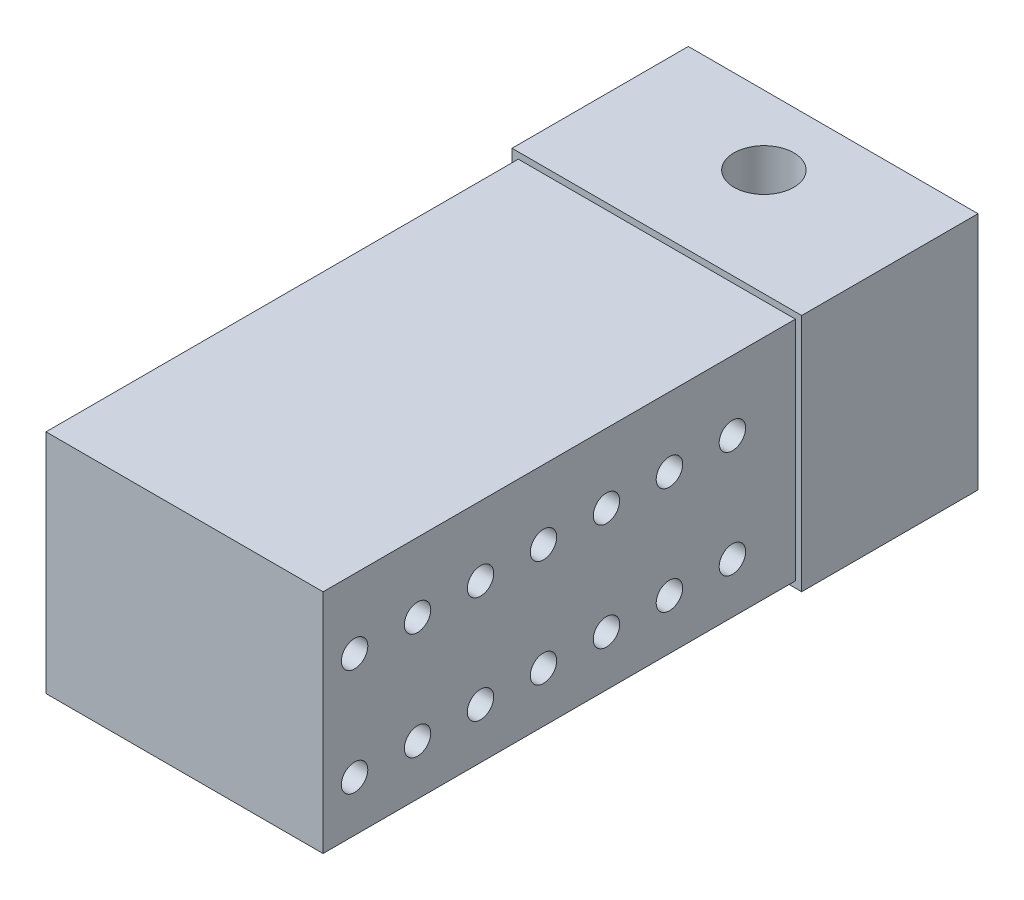
ISO-10303-21;
HEADER;
FILE_DESCRIPTION(('STEP AP214'),'2;1');
FILE_NAME('part.step','',(''),(''),'','','');
FILE_SCHEMA(('AUTOMOTIVE_DESIGN { 1 0 10303 214 1 1 1 1 }'));
ENDSEC;
DATA;
#1=APPLICATION_CONTEXT('core data for automotive mechanical design processes');
#2=APPLICATION_PROTOCOL_DEFINITION('international standard','automotive_design',2000,#1);
#3=PRODUCT_CONTEXT('',#1,'mechanical');
#4=PRODUCT('Part','Part','',(#3));
#5=PRODUCT_RELATED_PRODUCT_CATEGORY('part','',(#4));
#6=PRODUCT_DEFINITION_FORMATION('','',#4);
#7=PRODUCT_DEFINITION_CONTEXT('part definition',#1,'design');
#8=PRODUCT_DEFINITION('design','',#6,#7);
#9=PRODUCT_DEFINITION_SHAPE('','',#8);
#10=(LENGTH_UNIT() NAMED_UNIT(*) SI_UNIT(.MILLI.,.METRE.));
#11=(NAMED_UNIT(*) PLANE_ANGLE_UNIT() SI_UNIT($,.RADIAN.));
#12=(NAMED_UNIT(*) SI_UNIT($,.STERADIAN.) SOLID_ANGLE_UNIT());
#13=UNCERTAINTY_MEASURE_WITH_UNIT(LENGTH_MEASURE(1.E-05),#10,'distance_accuracy_value','');
#14=(GEOMETRIC_REPRESENTATION_CONTEXT(3) GLOBAL_UNCERTAINTY_ASSIGNED_CONTEXT((#13)) GLOBAL_UNIT_ASSIGNED_CONTEXT((#10,
#11,#12)) REPRESENTATION_CONTEXT('',''));
#15=CARTESIAN_POINT('',(0.,0.,0.));
#16=DIRECTION('',(0.,0.,1.));
#17=DIRECTION('',(1.,0.,0.));
#18=AXIS2_PLACEMENT_3D('',#15,#16,#17);
#19=CARTESIAN_POINT('',(0.,0.,7.112));
#20=DIRECTION('',(0.,0.,1.));
#21=DIRECTION('',(1.,0.,0.));
#22=AXIS2_PLACEMENT_3D('',#19,#20,#21);
#23=PLANE('',#22);
#24=DIRECTION('',(0.,1.,0.));
#25=VECTOR('',#24,1.);
#26=CARTESIAN_POINT('',(5.842,4.826,7.112));
#27=LINE('',#26,#25);
#28=CARTESIAN_POINT('',(5.842,-4.826,7.112));
#29=VERTEX_POINT('',#28);
#30=CARTESIAN_POINT('',(5.842,4.826,7.112));
#31=VERTEX_POINT('',#30);
#32=EDGE_CURVE('E250',#29,#31,#27,.T.);
#33=ORIENTED_EDGE('',*,*,#32,.T.);
#34=DIRECTION('',(-1.,0.,0.));
#35=VECTOR('',#34,1.);
#36=CARTESIAN_POINT('',(-5.842,4.826,7.112));
#37=LINE('',#36,#35);
#38=CARTESIAN_POINT('',(-5.842,4.826,7.112));
#39=VERTEX_POINT('',#38);
#40=EDGE_CURVE('E253',#31,#39,#37,.T.);
#41=ORIENTED_EDGE('',*,*,#40,.T.);
#42=DIRECTION('',(0.,-1.,0.));
#43=VECTOR('',#42,1.);
#44=CARTESIAN_POINT('',(-5.842,4.826,7.112));
#45=LINE('',#44,#43);
#46=CARTESIAN_POINT('',(-5.842,-4.826,7.112));
#47=VERTEX_POINT('',#46);
#48=EDGE_CURVE('E256',#39,#47,#45,.T.);
#49=ORIENTED_EDGE('',*,*,#48,.T.);
#50=DIRECTION('',(1.,0.,0.));
#51=VECTOR('',#50,1.);
#52=CARTESIAN_POINT('',(-5.842,-4.826,7.112));
#53=LINE('',#52,#51);
#54=EDGE_CURVE('E258',#47,#29,#53,.T.);
#55=ORIENTED_EDGE('',*,*,#54,.T.);
#56=EDGE_LOOP('',(#33,#41,#49,#55));
#57=FACE_BOUND('',#56,.T.);
#58=DIRECTION('',(1.,0.,0.));
#59=VECTOR('',#58,1.);
#60=CARTESIAN_POINT('',(-5.588,-4.572,7.112));
#61=LINE('',#60,#59);
#62=CARTESIAN_POINT('',(-5.588,-4.572,7.112));
#63=VERTEX_POINT('',#62);
#64=CARTESIAN_POINT('',(5.588,-4.572,7.112));
#65=VERTEX_POINT('',#64);
#66=EDGE_CURVE('E678',#63,#65,#61,.T.);
#67=ORIENTED_EDGE('',*,*,#66,.F.);
#68=DIRECTION('',(0.,-1.,0.));
#69=VECTOR('',#68,1.);
#70=CARTESIAN_POINT('',(-5.588,4.572,7.112));
#71=LINE('',#70,#69);
#72=CARTESIAN_POINT('',(-5.588,4.572,7.112));
#73=VERTEX_POINT('',#72);
#74=EDGE_CURVE('E172',#73,#63,#71,.T.);
#75=ORIENTED_EDGE('',*,*,#74,.F.);
#76=DIRECTION('',(-1.,0.,0.));
#77=VECTOR('',#76,1.);
#78=CARTESIAN_POINT('',(5.588,4.572,7.112));
#79=LINE('',#78,#77);
#80=CARTESIAN_POINT('',(5.588,4.572,7.112));
#81=VERTEX_POINT('',#80);
#82=EDGE_CURVE('E168',#81,#73,#79,.T.);
#83=ORIENTED_EDGE('',*,*,#82,.F.);
#84=DIRECTION('',(0.,1.,0.));
#85=VECTOR('',#84,1.);
#86=CARTESIAN_POINT('',(5.588,-4.572,7.112));
#87=LINE('',#86,#85);
#88=EDGE_CURVE('E680',#65,#81,#87,.T.);
#89=ORIENTED_EDGE('',*,*,#88,.F.);
#90=EDGE_LOOP('',(#67,#75,#83,#89));
#91=FACE_BOUND('',#90,.T.);
#92=ADVANCED_FACE('F33',(#57,#91),#23,.T.);
#93=CARTESIAN_POINT('',(0.,0.,0.));
#94=DIRECTION('',(0.,0.,1.));
#95=DIRECTION('',(1.,0.,0.));
#96=AXIS2_PLACEMENT_3D('',#93,#94,#95);
#97=PLANE('',#96);
#98=DIRECTION('',(0.,1.,0.));
#99=VECTOR('',#98,1.);
#100=CARTESIAN_POINT('',(5.842,4.826,0.));
#101=LINE('',#100,#99);
#102=CARTESIAN_POINT('',(5.842,-4.826,0.));
#103=VERTEX_POINT('',#102);
#104=CARTESIAN_POINT('',(5.842,4.826,0.));
#105=VERTEX_POINT('',#104);
#106=EDGE_CURVE('E249',#103,#105,#101,.T.);
#107=ORIENTED_EDGE('',*,*,#106,.F.);
#108=DIRECTION('',(1.,0.,0.));
#109=VECTOR('',#108,1.);
#110=CARTESIAN_POINT('',(-5.842,-4.826,0.));
#111=LINE('',#110,#109);
#112=CARTESIAN_POINT('',(-5.842,-4.826,0.));
#113=VERTEX_POINT('',#112);
#114=EDGE_CURVE('E254',#113,#103,#111,.T.);
#115=ORIENTED_EDGE('',*,*,#114,.F.);
#116=DIRECTION('',(0.,-1.,0.));
#117=VECTOR('',#116,1.);
#118=CARTESIAN_POINT('',(-5.842,4.826,0.));
#119=LINE('',#118,#117);
#120=CARTESIAN_POINT('',(-5.842,4.826,0.));
#121=VERTEX_POINT('',#120);
#122=EDGE_CURVE('E265',#121,#113,#119,.T.);
#123=ORIENTED_EDGE('',*,*,#122,.F.);
#124=DIRECTION('',(-1.,0.,0.));
#125=VECTOR('',#124,1.);
#126=CARTESIAN_POINT('',(-5.842,4.826,0.));
#127=LINE('',#126,#125);
#128=EDGE_CURVE('E263',#105,#121,#127,.T.);
#129=ORIENTED_EDGE('',*,*,#128,.F.);
#130=EDGE_LOOP('',(#107,#115,#123,#129));
#131=FACE_BOUND('',#130,.T.);
#132=DIRECTION('',(0.,-1.,0.));
#133=VECTOR('',#132,1.);
#134=CARTESIAN_POINT('',(-4.064,-0.381,0.));
#135=LINE('',#134,#133);
#136=CARTESIAN_POINT('',(-4.064,-0.381,0.));
#137=VERTEX_POINT('',#136);
#138=CARTESIAN_POINT('',(-4.064,-3.048,0.));
#139=VERTEX_POINT('',#138);
#140=EDGE_CURVE('E57',#137,#139,#135,.T.);
#141=ORIENTED_EDGE('',*,*,#140,.T.);
#142=DIRECTION('',(1.,0.,0.));
#143=VECTOR('',#142,1.);
#144=CARTESIAN_POINT('',(-4.064,-3.048,0.));
#145=LINE('',#144,#143);
#146=CARTESIAN_POINT('',(4.064,-3.048,0.));
#147=VERTEX_POINT('',#146);
#148=EDGE_CURVE('E214',#139,#147,#145,.T.);
#149=ORIENTED_EDGE('',*,*,#148,.T.);
#150=DIRECTION('',(0.,1.,0.));
#151=VECTOR('',#150,1.);
#152=CARTESIAN_POINT('',(4.064,-3.048,0.));
#153=LINE('',#152,#151);
#154=CARTESIAN_POINT('',(4.064,-0.381,0.));
#155=VERTEX_POINT('',#154);
#156=EDGE_CURVE('E217',#147,#155,#153,.T.);
#157=ORIENTED_EDGE('',*,*,#156,.T.);
#158=DIRECTION('',(-1.,0.,0.));
#159=VECTOR('',#158,1.);
#160=CARTESIAN_POINT('',(4.064,-0.381,0.));
#161=LINE('',#160,#159);
#162=CARTESIAN_POINT('',(3.048,-0.380999999999999,0.));
#163=VERTEX_POINT('',#162);
#164=EDGE_CURVE('E220',#155,#163,#161,.T.);
#165=ORIENTED_EDGE('',*,*,#164,.T.);
#166=DIRECTION('',(0.,1.,0.));
#167=VECTOR('',#166,1.);
#168=CARTESIAN_POINT('',(3.048,-0.380999999999999,0.));
#169=LINE('',#168,#167);
#170=CARTESIAN_POINT('',(3.048,3.048,0.));
#171=VERTEX_POINT('',#170);
#172=EDGE_CURVE('E223',#163,#171,#169,.T.);
#173=ORIENTED_EDGE('',*,*,#172,.T.);
#174=DIRECTION('',(-1.,0.,0.));
#175=VECTOR('',#174,1.);
#176=CARTESIAN_POINT('',(3.048,3.048,0.));
#177=LINE('',#176,#175);
#178=CARTESIAN_POINT('',(-3.048,3.048,0.));
#179=VERTEX_POINT('',#178);
#180=EDGE_CURVE('E226',#171,#179,#177,.T.);
#181=ORIENTED_EDGE('',*,*,#180,.T.);
#182=DIRECTION('',(0.,-1.,0.));
#183=VECTOR('',#182,1.);
#184=CARTESIAN_POINT('',(-3.048,3.048,0.));
#185=LINE('',#184,#183);
#186=CARTESIAN_POINT('',(-3.048,-0.380999999999999,0.));
#187=VERTEX_POINT('',#186);
#188=EDGE_CURVE('E229',#179,#187,#185,.T.);
#189=ORIENTED_EDGE('',*,*,#188,.T.);
#190=DIRECTION('',(-1.,0.,0.));
#191=VECTOR('',#190,1.);
#192=CARTESIAN_POINT('',(-3.048,-0.380999999999999,0.));
#193=LINE('',#192,#191);
#194=EDGE_CURVE('E191',#187,#137,#193,.T.);
#195=ORIENTED_EDGE('',*,*,#194,.T.);
#196=EDGE_LOOP('',(#141,#149,#157,#165,#173,#181,#189,#195));
#197=FACE_BOUND('',#196,.T.);
#198=ADVANCED_FACE('F284',(#131,#197),#97,.F.);
#199=CARTESIAN_POINT('',(5.842,4.826,7.112));
#200=DIRECTION('',(-1.,0.,0.));
#201=DIRECTION('',(0.,0.,1.));
#202=AXIS2_PLACEMENT_3D('',#199,#200,#201);
#203=PLANE('',#202);
#204=ORIENTED_EDGE('',*,*,#106,.T.);
#205=DIRECTION('',(0.,0.,-1.));
#206=VECTOR('',#205,1.);
#207=CARTESIAN_POINT('',(5.842,4.826,7.112));
#208=LINE('',#207,#206);
#209=EDGE_CURVE('E11',#31,#105,#208,.T.);
#210=ORIENTED_EDGE('',*,*,#209,.F.);
#211=ORIENTED_EDGE('',*,*,#32,.F.);
#212=DIRECTION('',(0.,0.,-1.));
#213=VECTOR('',#212,1.);
#214=CARTESIAN_POINT('',(5.842,-4.826,7.112));
#215=LINE('',#214,#213);
#216=EDGE_CURVE('E260',#29,#103,#215,.T.);
#217=ORIENTED_EDGE('',*,*,#216,.T.);
#218=EDGE_LOOP('',(#204,#210,#211,#217));
#219=FACE_BOUND('',#218,.T.);
#220=ADVANCED_FACE('F35',(#219),#203,.F.);
#221=CARTESIAN_POINT('',(-5.842,4.826,7.112));
#222=DIRECTION('',(0.,-1.,0.));
#223=DIRECTION('',(0.,0.,-1.));
#224=AXIS2_PLACEMENT_3D('',#221,#222,#223);
#225=PLANE('',#224);
#226=CARTESIAN_POINT('',(0.,4.826,2.794));
#227=DIRECTION('',(0.,-1.,0.));
#228=DIRECTION('',(0.,0.,-1.));
#229=AXIS2_PLACEMENT_3D('',#226,#227,#228);
#230=CIRCLE('',#229,1.2065);
#231=CARTESIAN_POINT('',(0.,4.826,1.5875));
#232=VERTEX_POINT('',#231);
#233=EDGE_CURVE('E184',#232,#232,#230,.T.);
#234=ORIENTED_EDGE('',*,*,#233,.T.);
#235=EDGE_LOOP('',(#234));
#236=FACE_BOUND('',#235,.T.);
#237=ORIENTED_EDGE('',*,*,#128,.T.);
#238=DIRECTION('',(0.,0.,-1.));
#239=VECTOR('',#238,1.);
#240=CARTESIAN_POINT('',(-5.842,4.826,7.112));
#241=LINE('',#240,#239);
#242=EDGE_CURVE('E42',#39,#121,#241,.T.);
#243=ORIENTED_EDGE('',*,*,#242,.F.);
#244=ORIENTED_EDGE('',*,*,#40,.F.);
#245=ORIENTED_EDGE('',*,*,#209,.T.);
#246=EDGE_LOOP('',(#237,#243,#244,#245));
#247=FACE_BOUND('',#246,.T.);
#248=ADVANCED_FACE('F295',(#236,#247),#225,.F.);
#249=CARTESIAN_POINT('',(-5.842,4.826,7.112));
#250=DIRECTION('',(1.,0.,0.));
#251=DIRECTION('',(0.,1.,0.));
#252=AXIS2_PLACEMENT_3D('',#249,#250,#251);
#253=PLANE('',#252);
#254=ORIENTED_EDGE('',*,*,#122,.T.);
#255=DIRECTION('',(0.,0.,-1.));
#256=VECTOR('',#255,1.);
#257=CARTESIAN_POINT('',(-5.842,-4.826,7.112));
#258=LINE('',#257,#256);
#259=EDGE_CURVE('E270',#47,#113,#258,.T.);
#260=ORIENTED_EDGE('',*,*,#259,.F.);
#261=ORIENTED_EDGE('',*,*,#48,.F.);
#262=ORIENTED_EDGE('',*,*,#242,.T.);
#263=EDGE_LOOP('',(#254,#260,#261,#262));
#264=FACE_BOUND('',#263,.T.);
#265=ADVANCED_FACE('F278',(#264),#253,.F.);
#266=CARTESIAN_POINT('',(-5.842,-4.826,7.112));
#267=DIRECTION('',(0.,1.,0.));
#268=DIRECTION('',(0.,0.,1.));
#269=AXIS2_PLACEMENT_3D('',#266,#267,#268);
#270=PLANE('',#269);
#271=CARTESIAN_POINT('',(0.,-4.826,2.794));
#272=DIRECTION('',(0.,1.,0.));
#273=DIRECTION('',(0.,0.,1.));
#274=AXIS2_PLACEMENT_3D('',#271,#272,#273);
#275=CIRCLE('',#274,1.2065);
#276=CARTESIAN_POINT('',(0.,-4.826,4.0005));
#277=VERTEX_POINT('',#276);
#278=EDGE_CURVE('E174',#277,#277,#275,.T.);
#279=ORIENTED_EDGE('',*,*,#278,.T.);
#280=EDGE_LOOP('',(#279));
#281=FACE_BOUND('',#280,.T.);
#282=ORIENTED_EDGE('',*,*,#114,.T.);
#283=ORIENTED_EDGE('',*,*,#216,.F.);
#284=ORIENTED_EDGE('',*,*,#54,.F.);
#285=ORIENTED_EDGE('',*,*,#259,.T.);
#286=EDGE_LOOP('',(#282,#283,#284,#285));
#287=FACE_BOUND('',#286,.T.);
#288=ADVANCED_FACE('F288',(#281,#287),#270,.F.);
#289=CARTESIAN_POINT('',(-4.064,-0.381,7.112));
#290=DIRECTION('',(1.,0.,0.));
#291=DIRECTION('',(0.,0.,-1.));
#292=AXIS2_PLACEMENT_3D('',#289,#290,#291);
#293=PLANE('',#292);
#294=ORIENTED_EDGE('',*,*,#140,.F.);
#295=DIRECTION('',(0.,0.,-1.));
#296=VECTOR('',#295,1.);
#297=CARTESIAN_POINT('',(-4.064,-0.381,7.112));
#298=LINE('',#297,#296);
#299=CARTESIAN_POINT('',(-4.064,-0.381,7.112));
#300=VERTEX_POINT('',#299);
#301=EDGE_CURVE('E212',#300,#137,#298,.T.);
#302=ORIENTED_EDGE('',*,*,#301,.F.);
#303=DIRECTION('',(0.,-1.,0.));
#304=VECTOR('',#303,1.);
#305=CARTESIAN_POINT('',(-4.064,-0.381,7.112));
#306=LINE('',#305,#304);
#307=CARTESIAN_POINT('',(-4.064,-3.048,7.112));
#308=VERTEX_POINT('',#307);
#309=EDGE_CURVE('E187',#300,#308,#306,.T.);
#310=ORIENTED_EDGE('',*,*,#309,.T.);
#311=DIRECTION('',(0.,0.,-1.));
#312=VECTOR('',#311,1.);
#313=CARTESIAN_POINT('',(-4.064,-3.048,7.112));
#314=LINE('',#313,#312);
#315=EDGE_CURVE('E247',#308,#139,#314,.T.);
#316=ORIENTED_EDGE('',*,*,#315,.T.);
#317=EDGE_LOOP('',(#294,#302,#310,#316));
#318=FACE_BOUND('',#317,.T.);
#319=ADVANCED_FACE('F310',(#318),#293,.T.);
#320=CARTESIAN_POINT('',(-4.064,-3.048,7.112));
#321=DIRECTION('',(0.,1.,0.));
#322=DIRECTION('',(0.,0.,1.));
#323=AXIS2_PLACEMENT_3D('',#320,#321,#322);
#324=PLANE('',#323);
#325=CARTESIAN_POINT('',(0.,-3.048,2.794));
#326=DIRECTION('',(0.,1.,0.));
#327=DIRECTION('',(0.,0.,1.));
#328=AXIS2_PLACEMENT_3D('',#325,#326,#327);
#329=CIRCLE('',#328,1.2065);
#330=CARTESIAN_POINT('',(0.,-3.048,4.0005));
#331=VERTEX_POINT('',#330);
#332=EDGE_CURVE('E181',#331,#331,#329,.T.);
#333=ORIENTED_EDGE('',*,*,#332,.F.);
#334=EDGE_LOOP('',(#333));
#335=FACE_BOUND('',#334,.T.);
#336=ORIENTED_EDGE('',*,*,#148,.F.);
#337=ORIENTED_EDGE('',*,*,#315,.F.);
#338=DIRECTION('',(1.,0.,0.));
#339=VECTOR('',#338,1.);
#340=CARTESIAN_POINT('',(-4.064,-3.048,7.112));
#341=LINE('',#340,#339);
#342=CARTESIAN_POINT('',(4.064,-3.048,7.112));
#343=VERTEX_POINT('',#342);
#344=EDGE_CURVE('E190',#308,#343,#341,.T.);
#345=ORIENTED_EDGE('',*,*,#344,.T.);
#346=DIRECTION('',(0.,0.,-1.));
#347=VECTOR('',#346,1.);
#348=CARTESIAN_POINT('',(4.064,-3.048,7.112));
#349=LINE('',#348,#347);
#350=EDGE_CURVE('E245',#343,#147,#349,.T.);
#351=ORIENTED_EDGE('',*,*,#350,.T.);
#352=EDGE_LOOP('',(#336,#337,#345,#351));
#353=FACE_BOUND('',#352,.T.);
#354=ADVANCED_FACE('F318',(#335,#353),#324,.T.);
#355=CARTESIAN_POINT('',(4.064,-3.048,7.112));
#356=DIRECTION('',(-1.,0.,0.));
#357=DIRECTION('',(0.,0.,1.));
#358=AXIS2_PLACEMENT_3D('',#355,#356,#357);
#359=PLANE('',#358);
#360=ORIENTED_EDGE('',*,*,#156,.F.);
#361=ORIENTED_EDGE('',*,*,#350,.F.);
#362=DIRECTION('',(0.,1.,0.));
#363=VECTOR('',#362,1.);
#364=CARTESIAN_POINT('',(4.064,-3.048,7.112));
#365=LINE('',#364,#363);
#366=CARTESIAN_POINT('',(4.064,-0.381,7.112));
#367=VERTEX_POINT('',#366);
#368=EDGE_CURVE('E194',#343,#367,#365,.T.);
#369=ORIENTED_EDGE('',*,*,#368,.T.);
#370=DIRECTION('',(0.,0.,-1.));
#371=VECTOR('',#370,1.);
#372=CARTESIAN_POINT('',(4.064,-0.381,7.112));
#373=LINE('',#372,#371);
#374=EDGE_CURVE('E243',#367,#155,#373,.T.);
#375=ORIENTED_EDGE('',*,*,#374,.T.);
#376=EDGE_LOOP('',(#360,#361,#369,#375));
#377=FACE_BOUND('',#376,.T.);
#378=ADVANCED_FACE('F356',(#377),#359,.T.);
#379=CARTESIAN_POINT('',(4.064,-0.381,7.112));
#380=DIRECTION('',(0.,-1.,0.));
#381=DIRECTION('',(1.,0.,0.));
#382=AXIS2_PLACEMENT_3D('',#379,#380,#381);
#383=PLANE('',#382);
#384=ORIENTED_EDGE('',*,*,#164,.F.);
#385=ORIENTED_EDGE('',*,*,#374,.F.);
#386=DIRECTION('',(-1.,0.,0.));
#387=VECTOR('',#386,1.);
#388=CARTESIAN_POINT('',(4.064,-0.381,7.112));
#389=LINE('',#388,#387);
#390=CARTESIAN_POINT('',(3.048,-0.380999999999999,7.112));
#391=VERTEX_POINT('',#390);
#392=EDGE_CURVE('E197',#367,#391,#389,.T.);
#393=ORIENTED_EDGE('',*,*,#392,.T.);
#394=DIRECTION('',(0.,0.,-1.));
#395=VECTOR('',#394,1.);
#396=CARTESIAN_POINT('',(3.048,-0.380999999999999,7.112));
#397=LINE('',#396,#395);
#398=EDGE_CURVE('E241',#391,#163,#397,.T.);
#399=ORIENTED_EDGE('',*,*,#398,.T.);
#400=EDGE_LOOP('',(#384,#385,#393,#399));
#401=FACE_BOUND('',#400,.T.);
#402=ADVANCED_FACE('F352',(#401),#383,.T.);
#403=CARTESIAN_POINT('',(3.048,-0.380999999999999,7.112));
#404=DIRECTION('',(-1.,0.,0.));
#405=DIRECTION('',(0.,-1.,0.));
#406=AXIS2_PLACEMENT_3D('',#403,#404,#405);
#407=PLANE('',#406);
#408=ORIENTED_EDGE('',*,*,#172,.F.);
#409=ORIENTED_EDGE('',*,*,#398,.F.);
#410=DIRECTION('',(0.,1.,0.));
#411=VECTOR('',#410,1.);
#412=CARTESIAN_POINT('',(3.048,-0.380999999999999,7.112));
#413=LINE('',#412,#411);
#414=CARTESIAN_POINT('',(3.048,3.048,7.112));
#415=VERTEX_POINT('',#414);
#416=EDGE_CURVE('E200',#391,#415,#413,.T.);
#417=ORIENTED_EDGE('',*,*,#416,.T.);
#418=DIRECTION('',(0.,0.,-1.));
#419=VECTOR('',#418,1.);
#420=CARTESIAN_POINT('',(3.048,3.048,7.112));
#421=LINE('',#420,#419);
#422=EDGE_CURVE('E239',#415,#171,#421,.T.);
#423=ORIENTED_EDGE('',*,*,#422,.T.);
#424=EDGE_LOOP('',(#408,#409,#417,#423));
#425=FACE_BOUND('',#424,.T.);
#426=ADVANCED_FACE('F348',(#425),#407,.T.);
#427=CARTESIAN_POINT('',(3.048,3.048,7.112));
#428=DIRECTION('',(0.,-1.,0.));
#429=DIRECTION('',(0.,0.,-1.));
#430=AXIS2_PLACEMENT_3D('',#427,#428,#429);
#431=PLANE('',#430);
#432=CARTESIAN_POINT('',(0.,3.048,2.794));
#433=DIRECTION('',(0.,-1.,0.));
#434=DIRECTION('',(0.,0.,-1.));
#435=AXIS2_PLACEMENT_3D('',#432,#433,#434);
#436=CIRCLE('',#435,1.2065);
#437=CARTESIAN_POINT('',(0.,3.048,1.5875));
#438=VERTEX_POINT('',#437);
#439=EDGE_CURVE('E37',#438,#438,#436,.T.);
#440=ORIENTED_EDGE('',*,*,#439,.F.);
#441=EDGE_LOOP('',(#440));
#442=FACE_BOUND('',#441,.T.);
#443=ORIENTED_EDGE('',*,*,#180,.F.);
#444=ORIENTED_EDGE('',*,*,#422,.F.);
#445=DIRECTION('',(-1.,0.,0.));
#446=VECTOR('',#445,1.);
#447=CARTESIAN_POINT('',(3.048,3.048,7.112));
#448=LINE('',#447,#446);
#449=CARTESIAN_POINT('',(-3.048,3.048,7.112));
#450=VERTEX_POINT('',#449);
#451=EDGE_CURVE('E203',#415,#450,#448,.T.);
#452=ORIENTED_EDGE('',*,*,#451,.T.);
#453=DIRECTION('',(0.,0.,-1.));
#454=VECTOR('',#453,1.);
#455=CARTESIAN_POINT('',(-3.048,3.048,7.112));
#456=LINE('',#455,#454);
#457=EDGE_CURVE('E237',#450,#179,#456,.T.);
#458=ORIENTED_EDGE('',*,*,#457,.T.);
#459=EDGE_LOOP('',(#443,#444,#452,#458));
#460=FACE_BOUND('',#459,.T.);
#461=ADVANCED_FACE('F344',(#442,#460),#431,.T.);
#462=CARTESIAN_POINT('',(-3.048,3.048,7.112));
#463=DIRECTION('',(1.,0.,0.));
#464=DIRECTION('',(0.,1.,0.));
#465=AXIS2_PLACEMENT_3D('',#462,#463,#464);
#466=PLANE('',#465);
#467=ORIENTED_EDGE('',*,*,#188,.F.);
#468=ORIENTED_EDGE('',*,*,#457,.F.);
#469=DIRECTION('',(0.,-1.,0.));
#470=VECTOR('',#469,1.);
#471=CARTESIAN_POINT('',(-3.048,3.048,7.112));
#472=LINE('',#471,#470);
#473=CARTESIAN_POINT('',(-3.048,-0.380999999999999,7.112));
#474=VERTEX_POINT('',#473);
#475=EDGE_CURVE('E206',#450,#474,#472,.T.);
#476=ORIENTED_EDGE('',*,*,#475,.T.);
#477=DIRECTION('',(0.,0.,-1.));
#478=VECTOR('',#477,1.);
#479=CARTESIAN_POINT('',(-3.048,-0.380999999999999,7.112));
#480=LINE('',#479,#478);
#481=EDGE_CURVE('E235',#474,#187,#480,.T.);
#482=ORIENTED_EDGE('',*,*,#481,.T.);
#483=EDGE_LOOP('',(#467,#468,#476,#482));
#484=FACE_BOUND('',#483,.T.);
#485=ADVANCED_FACE('F340',(#484),#466,.T.);
#486=CARTESIAN_POINT('',(-3.048,-0.380999999999999,7.112));
#487=DIRECTION('',(0.,-1.,0.));
#488=DIRECTION('',(1.,0.,0.));
#489=AXIS2_PLACEMENT_3D('',#486,#487,#488);
#490=PLANE('',#489);
#491=ORIENTED_EDGE('',*,*,#194,.F.);
#492=ORIENTED_EDGE('',*,*,#481,.F.);
#493=DIRECTION('',(-1.,0.,0.));
#494=VECTOR('',#493,1.);
#495=CARTESIAN_POINT('',(-3.048,-0.380999999999999,7.112));
#496=LINE('',#495,#494);
#497=EDGE_CURVE('E209',#474,#300,#496,.T.);
#498=ORIENTED_EDGE('',*,*,#497,.T.);
#499=ORIENTED_EDGE('',*,*,#301,.T.);
#500=EDGE_LOOP('',(#491,#492,#498,#499));
#501=FACE_BOUND('',#500,.T.);
#502=ADVANCED_FACE('F333',(#501),#490,.T.);
#503=CARTESIAN_POINT('',(0.,-4.826,2.794));
#504=DIRECTION('',(0.,1.,0.));
#505=DIRECTION('',(0.,0.,1.));
#506=AXIS2_PLACEMENT_3D('',#503,#504,#505);
#507=CYLINDRICAL_SURFACE('',#506,1.2065);
#508=ORIENTED_EDGE('',*,*,#439,.T.);
#509=EDGE_LOOP('',(#508));
#510=FACE_BOUND('',#509,.T.);
#511=ORIENTED_EDGE('',*,*,#233,.F.);
#512=EDGE_LOOP('',(#511));
#513=FACE_BOUND('',#512,.T.);
#514=ADVANCED_FACE('F324',(#510,#513),#507,.F.);
#515=ORIENTED_EDGE('',*,*,#332,.T.);
#516=EDGE_LOOP('',(#515));
#517=FACE_BOUND('',#516,.T.);
#518=ORIENTED_EDGE('',*,*,#278,.F.);
#519=EDGE_LOOP('',(#518));
#520=FACE_BOUND('',#519,.T.);
#521=ADVANCED_FACE('F321',(#517,#520),#507,.F.);
#522=CARTESIAN_POINT('',(0.,0.,7.112));
#523=DIRECTION('',(0.,0.,1.));
#524=DIRECTION('',(1.,0.,0.));
#525=AXIS2_PLACEMENT_3D('',#522,#523,#524);
#526=PLANE('',#525);
#527=ORIENTED_EDGE('',*,*,#309,.F.);
#528=ORIENTED_EDGE('',*,*,#497,.F.);
#529=ORIENTED_EDGE('',*,*,#475,.F.);
#530=ORIENTED_EDGE('',*,*,#451,.F.);
#531=ORIENTED_EDGE('',*,*,#416,.F.);
#532=ORIENTED_EDGE('',*,*,#392,.F.);
#533=ORIENTED_EDGE('',*,*,#368,.F.);
#534=ORIENTED_EDGE('',*,*,#344,.F.);
#535=EDGE_LOOP('',(#527,#528,#529,#530,#531,#532,#533,#534));
#536=FACE_BOUND('',#535,.T.);
#537=ADVANCED_FACE('F323',(#536),#526,.F.);
#538=CARTESIAN_POINT('',(-5.588,4.572,26.162));
#539=DIRECTION('',(1.,0.,0.));
#540=DIRECTION('',(0.,0.,-1.));
#541=AXIS2_PLACEMENT_3D('',#538,#539,#540);
#542=PLANE('',#541);
#543=CARTESIAN_POINT('',(-5.588,-2.54000000000002,12.192));
#544=DIRECTION('',(1.,0.,0.));
#545=DIRECTION('',(0.,0.,-1.));
#546=AXIS2_PLACEMENT_3D('',#543,#544,#545);
#547=CIRCLE('',#546,0.5334);
#548=CARTESIAN_POINT('',(-5.588,-2.54000000000002,11.6586));
#549=VERTEX_POINT('',#548);
#550=EDGE_CURVE('E660',#549,#549,#547,.T.);
#551=ORIENTED_EDGE('',*,*,#550,.T.);
#552=EDGE_LOOP('',(#551));
#553=FACE_BOUND('',#552,.T.);
#554=CARTESIAN_POINT('',(-5.588,-2.54000000000003,14.732));
#555=DIRECTION('',(1.,0.,0.));
#556=DIRECTION('',(0.,0.,-1.));
#557=AXIS2_PLACEMENT_3D('',#554,#555,#556);
#558=CIRCLE('',#557,0.533400000000001);
#559=CARTESIAN_POINT('',(-5.588,-2.54000000000003,14.1986));
#560=VERTEX_POINT('',#559);
#561=EDGE_CURVE('E662',#560,#560,#558,.T.);
#562=ORIENTED_EDGE('',*,*,#561,.T.);
#563=EDGE_LOOP('',(#562));
#564=FACE_BOUND('',#563,.T.);
#565=CARTESIAN_POINT('',(-5.588,-2.54000000000005,17.272));
#566=DIRECTION('',(1.,0.,0.));
#567=DIRECTION('',(0.,0.,-1.));
#568=AXIS2_PLACEMENT_3D('',#565,#566,#567);
#569=CIRCLE('',#568,0.533400000000001);
#570=CARTESIAN_POINT('',(-5.588,-2.54000000000005,16.7386));
#571=VERTEX_POINT('',#570);
#572=EDGE_CURVE('E668',#571,#571,#569,.T.);
#573=ORIENTED_EDGE('',*,*,#572,.T.);
#574=EDGE_LOOP('',(#573));
#575=FACE_BOUND('',#574,.T.);
#576=CARTESIAN_POINT('',(-5.588,-2.54000000000007,19.812));
#577=DIRECTION('',(1.,0.,0.));
#578=DIRECTION('',(0.,0.,-1.));
#579=AXIS2_PLACEMENT_3D('',#576,#577,#578);
#580=CIRCLE('',#579,0.533400000000001);
#581=CARTESIAN_POINT('',(-5.588,-2.54000000000007,19.2786));
#582=VERTEX_POINT('',#581);
#583=EDGE_CURVE('E691',#582,#582,#580,.T.);
#584=ORIENTED_EDGE('',*,*,#583,.T.);
#585=EDGE_LOOP('',(#584));
#586=FACE_BOUND('',#585,.T.);
#587=CARTESIAN_POINT('',(-5.588,-2.54000000000009,22.352));
#588=DIRECTION('',(1.,0.,0.));
#589=DIRECTION('',(0.,0.,-1.));
#590=AXIS2_PLACEMENT_3D('',#587,#588,#589);
#591=CIRCLE('',#590,0.533400000000001);
#592=CARTESIAN_POINT('',(-5.588,-2.54000000000009,21.8186));
#593=VERTEX_POINT('',#592);
#594=EDGE_CURVE('E694',#593,#593,#591,.T.);
#595=ORIENTED_EDGE('',*,*,#594,.T.);
#596=EDGE_LOOP('',(#595));
#597=FACE_BOUND('',#596,.T.);
#598=CARTESIAN_POINT('',(-5.588,-2.54000000000011,24.892));
#599=DIRECTION('',(1.,0.,0.));
#600=DIRECTION('',(0.,0.,-1.));
#601=AXIS2_PLACEMENT_3D('',#598,#599,#600);
#602=CIRCLE('',#601,0.533400000000001);
#603=CARTESIAN_POINT('',(-5.588,-2.54000000000011,24.3586));
#604=VERTEX_POINT('',#603);
#605=EDGE_CURVE('E697',#604,#604,#602,.T.);
#606=ORIENTED_EDGE('',*,*,#605,.T.);
#607=EDGE_LOOP('',(#606));
#608=FACE_BOUND('',#607,.T.);
#609=CARTESIAN_POINT('',(-5.588,1.77799999999993,19.812));
#610=DIRECTION('',(1.,0.,0.));
#611=DIRECTION('',(0.,0.,-1.));
#612=AXIS2_PLACEMENT_3D('',#609,#610,#611);
#613=CIRCLE('',#612,0.533399999999998);
#614=CARTESIAN_POINT('',(-5.588,1.77799999999993,19.2786));
#615=VERTEX_POINT('',#614);
#616=EDGE_CURVE('E700',#615,#615,#613,.T.);
#617=ORIENTED_EDGE('',*,*,#616,.T.);
#618=EDGE_LOOP('',(#617));
#619=FACE_BOUND('',#618,.T.);
#620=CARTESIAN_POINT('',(-5.588,1.77799999999991,22.352));
#621=DIRECTION('',(1.,0.,0.));
#622=DIRECTION('',(0.,0.,-1.));
#623=AXIS2_PLACEMENT_3D('',#620,#621,#622);
#624=CIRCLE('',#623,0.533399999999998);
#625=CARTESIAN_POINT('',(-5.588,1.77799999999991,21.8186));
#626=VERTEX_POINT('',#625);
#627=EDGE_CURVE('E703',#626,#626,#624,.T.);
#628=ORIENTED_EDGE('',*,*,#627,.T.);
#629=EDGE_LOOP('',(#628));
#630=FACE_BOUND('',#629,.T.);
#631=CARTESIAN_POINT('',(-5.588,1.77799999999989,24.892));
#632=DIRECTION('',(1.,0.,0.));
#633=DIRECTION('',(0.,0.,-1.));
#634=AXIS2_PLACEMENT_3D('',#631,#632,#633);
#635=CIRCLE('',#634,0.533400000000001);
#636=CARTESIAN_POINT('',(-5.588,1.77799999999989,24.3586));
#637=VERTEX_POINT('',#636);
#638=EDGE_CURVE('E706',#637,#637,#635,.T.);
#639=ORIENTED_EDGE('',*,*,#638,.T.);
#640=EDGE_LOOP('',(#639));
#641=FACE_BOUND('',#640,.T.);
#642=CARTESIAN_POINT('',(-5.588,1.778,9.65200000000002));
#643=DIRECTION('',(1.,0.,0.));
#644=DIRECTION('',(0.,0.,-1.));
#645=AXIS2_PLACEMENT_3D('',#642,#643,#644);
#646=CIRCLE('',#645,0.5334);
#647=CARTESIAN_POINT('',(-5.588,1.778,9.11860000000002));
#648=VERTEX_POINT('',#647);
#649=EDGE_CURVE('E709',#648,#648,#646,.T.);
#650=ORIENTED_EDGE('',*,*,#649,.T.);
#651=EDGE_LOOP('',(#650));
#652=FACE_BOUND('',#651,.T.);
#653=CARTESIAN_POINT('',(-5.588,1.77799999999995,17.272));
#654=DIRECTION('',(1.,0.,0.));
#655=DIRECTION('',(0.,0.,-1.));
#656=AXIS2_PLACEMENT_3D('',#653,#654,#655);
#657=CIRCLE('',#656,0.533400000000001);
#658=CARTESIAN_POINT('',(-5.588,1.77799999999995,16.7386));
#659=VERTEX_POINT('',#658);
#660=EDGE_CURVE('E712',#659,#659,#657,.T.);
#661=ORIENTED_EDGE('',*,*,#660,.T.);
#662=EDGE_LOOP('',(#661));
#663=FACE_BOUND('',#662,.T.);
#664=CARTESIAN_POINT('',(-5.588,1.77799999999997,14.732));
#665=DIRECTION('',(1.,0.,0.));
#666=DIRECTION('',(0.,0.,-1.));
#667=AXIS2_PLACEMENT_3D('',#664,#665,#666);
#668=CIRCLE('',#667,0.5334);
#669=CARTESIAN_POINT('',(-5.588,1.77799999999997,14.1986));
#670=VERTEX_POINT('',#669);
#671=EDGE_CURVE('E715',#670,#670,#668,.T.);
#672=ORIENTED_EDGE('',*,*,#671,.T.);
#673=EDGE_LOOP('',(#672));
#674=FACE_BOUND('',#673,.T.);
#675=CARTESIAN_POINT('',(-5.588,1.77799999999998,12.192));
#676=DIRECTION('',(1.,0.,0.));
#677=DIRECTION('',(0.,0.,-1.));
#678=AXIS2_PLACEMENT_3D('',#675,#676,#677);
#679=CIRCLE('',#678,0.533399999999998);
#680=CARTESIAN_POINT('',(-5.588,1.77799999999998,11.6586));
#681=VERTEX_POINT('',#680);
#682=EDGE_CURVE('E718',#681,#681,#679,.T.);
#683=ORIENTED_EDGE('',*,*,#682,.T.);
#684=EDGE_LOOP('',(#683));
#685=FACE_BOUND('',#684,.T.);
#686=CARTESIAN_POINT('',(-5.588,-2.54,9.652));
#687=DIRECTION('',(1.,0.,0.));
#688=DIRECTION('',(0.,0.,-1.));
#689=AXIS2_PLACEMENT_3D('',#686,#687,#688);
#690=CIRCLE('',#689,0.5334);
#691=CARTESIAN_POINT('',(-5.588,-2.54,9.1186));
#692=VERTEX_POINT('',#691);
#693=EDGE_CURVE('E665',#692,#692,#690,.T.);
#694=ORIENTED_EDGE('',*,*,#693,.T.);
#695=EDGE_LOOP('',(#694));
#696=FACE_BOUND('',#695,.T.);
#697=ORIENTED_EDGE('',*,*,#74,.T.);
#698=DIRECTION('',(0.,0.,-1.));
#699=VECTOR('',#698,1.);
#700=CARTESIAN_POINT('',(-5.588,-4.572,26.162));
#701=LINE('',#700,#699);
#702=CARTESIAN_POINT('',(-5.588,-4.572,26.162));
#703=VERTEX_POINT('',#702);
#704=EDGE_CURVE('E153',#703,#63,#701,.T.);
#705=ORIENTED_EDGE('',*,*,#704,.F.);
#706=DIRECTION('',(0.,-1.,0.));
#707=VECTOR('',#706,1.);
#708=CARTESIAN_POINT('',(-5.588,4.572,26.162));
#709=LINE('',#708,#707);
#710=CARTESIAN_POINT('',(-5.588,4.572,26.162));
#711=VERTEX_POINT('',#710);
#712=EDGE_CURVE('E160',#711,#703,#709,.T.);
#713=ORIENTED_EDGE('',*,*,#712,.F.);
#714=DIRECTION('',(0.,0.,-1.));
#715=VECTOR('',#714,1.);
#716=CARTESIAN_POINT('',(-5.588,4.572,26.162));
#717=LINE('',#716,#715);
#718=EDGE_CURVE('E676',#711,#73,#717,.T.);
#719=ORIENTED_EDGE('',*,*,#718,.T.);
#720=EDGE_LOOP('',(#697,#705,#713,#719));
#721=FACE_BOUND('',#720,.T.);
#722=ADVANCED_FACE('F170',(#553,#564,#575,#586,#597,#608,#619,#630,#641,#652,#663,#674,#685,
#696,#721),#542,.F.);
#723=CARTESIAN_POINT('',(-5.588,-4.572,26.162));
#724=DIRECTION('',(0.,1.,0.));
#725=DIRECTION('',(0.,0.,1.));
#726=AXIS2_PLACEMENT_3D('',#723,#724,#725);
#727=PLANE('',#726);
#728=ORIENTED_EDGE('',*,*,#66,.T.);
#729=DIRECTION('',(0.,0.,-1.));
#730=VECTOR('',#729,1.);
#731=CARTESIAN_POINT('',(5.588,-4.572,26.162));
#732=LINE('',#731,#730);
#733=CARTESIAN_POINT('',(5.588,-4.572,26.162));
#734=VERTEX_POINT('',#733);
#735=EDGE_CURVE('E156',#734,#65,#732,.T.);
#736=ORIENTED_EDGE('',*,*,#735,.F.);
#737=DIRECTION('',(1.,0.,0.));
#738=VECTOR('',#737,1.);
#739=CARTESIAN_POINT('',(-5.588,-4.572,26.162));
#740=LINE('',#739,#738);
#741=EDGE_CURVE('E149',#703,#734,#740,.T.);
#742=ORIENTED_EDGE('',*,*,#741,.F.);
#743=ORIENTED_EDGE('',*,*,#704,.T.);
#744=EDGE_LOOP('',(#728,#736,#742,#743));
#745=FACE_BOUND('',#744,.T.);
#746=ADVANCED_FACE('F151',(#745),#727,.F.);
#747=CARTESIAN_POINT('',(5.588,-4.572,26.162));
#748=DIRECTION('',(-1.,0.,0.));
#749=DIRECTION('',(0.,0.,1.));
#750=AXIS2_PLACEMENT_3D('',#747,#748,#749);
#751=PLANE('',#750);
#752=CARTESIAN_POINT('',(5.588,-2.54000000000002,12.192));
#753=DIRECTION('',(1.,0.,0.));
#754=DIRECTION('',(0.,0.,-1.));
#755=AXIS2_PLACEMENT_3D('',#752,#753,#754);
#756=CIRCLE('',#755,0.5334);
#757=CARTESIAN_POINT('',(5.588,-2.54000000000002,11.6586));
#758=VERTEX_POINT('',#757);
#759=EDGE_CURVE('E657',#758,#758,#756,.T.);
#760=ORIENTED_EDGE('',*,*,#759,.F.);
#761=EDGE_LOOP('',(#760));
#762=FACE_BOUND('',#761,.T.);
#763=CARTESIAN_POINT('',(5.588,-2.54000000000003,14.732));
#764=DIRECTION('',(1.,0.,0.));
#765=DIRECTION('',(0.,0.,-1.));
#766=AXIS2_PLACEMENT_3D('',#763,#764,#765);
#767=CIRCLE('',#766,0.533400000000001);
#768=CARTESIAN_POINT('',(5.588,-2.54000000000003,14.1986));
#769=VERTEX_POINT('',#768);
#770=EDGE_CURVE('E754',#769,#769,#767,.T.);
#771=ORIENTED_EDGE('',*,*,#770,.F.);
#772=EDGE_LOOP('',(#771));
#773=FACE_BOUND('',#772,.T.);
#774=CARTESIAN_POINT('',(5.588,-2.54000000000005,17.272));
#775=DIRECTION('',(1.,0.,0.));
#776=DIRECTION('',(0.,0.,-1.));
#777=AXIS2_PLACEMENT_3D('',#774,#775,#776);
#778=CIRCLE('',#777,0.533400000000001);
#779=CARTESIAN_POINT('',(5.588,-2.54000000000005,16.7386));
#780=VERTEX_POINT('',#779);
#781=EDGE_CURVE('E751',#780,#780,#778,.T.);
#782=ORIENTED_EDGE('',*,*,#781,.F.);
#783=EDGE_LOOP('',(#782));
#784=FACE_BOUND('',#783,.T.);
#785=CARTESIAN_POINT('',(5.588,-2.54000000000007,19.812));
#786=DIRECTION('',(1.,0.,0.));
#787=DIRECTION('',(0.,0.,-1.));
#788=AXIS2_PLACEMENT_3D('',#785,#786,#787);
#789=CIRCLE('',#788,0.533400000000001);
#790=CARTESIAN_POINT('',(5.588,-2.54000000000007,19.2786));
#791=VERTEX_POINT('',#790);
#792=EDGE_CURVE('E748',#791,#791,#789,.T.);
#793=ORIENTED_EDGE('',*,*,#792,.F.);
#794=EDGE_LOOP('',(#793));
#795=FACE_BOUND('',#794,.T.);
#796=CARTESIAN_POINT('',(5.588,-2.54000000000009,22.352));
#797=DIRECTION('',(1.,0.,0.));
#798=DIRECTION('',(0.,0.,-1.));
#799=AXIS2_PLACEMENT_3D('',#796,#797,#798);
#800=CIRCLE('',#799,0.533400000000001);
#801=CARTESIAN_POINT('',(5.588,-2.54000000000009,21.8186));
#802=VERTEX_POINT('',#801);
#803=EDGE_CURVE('E745',#802,#802,#800,.T.);
#804=ORIENTED_EDGE('',*,*,#803,.F.);
#805=EDGE_LOOP('',(#804));
#806=FACE_BOUND('',#805,.T.);
#807=CARTESIAN_POINT('',(5.588,-2.54000000000011,24.892));
#808=DIRECTION('',(1.,0.,0.));
#809=DIRECTION('',(0.,0.,-1.));
#810=AXIS2_PLACEMENT_3D('',#807,#808,#809);
#811=CIRCLE('',#810,0.533400000000001);
#812=CARTESIAN_POINT('',(5.588,-2.54000000000011,24.3586));
#813=VERTEX_POINT('',#812);
#814=EDGE_CURVE('E731',#813,#813,#811,.T.);
#815=ORIENTED_EDGE('',*,*,#814,.F.);
#816=EDGE_LOOP('',(#815));
#817=FACE_BOUND('',#816,.T.);
#818=CARTESIAN_POINT('',(5.588,1.77799999999993,19.812));
#819=DIRECTION('',(1.,0.,0.));
#820=DIRECTION('',(0.,0.,-1.));
#821=AXIS2_PLACEMENT_3D('',#818,#819,#820);
#822=CIRCLE('',#821,0.533399999999998);
#823=CARTESIAN_POINT('',(5.588,1.77799999999993,19.2786));
#824=VERTEX_POINT('',#823);
#825=EDGE_CURVE('E725',#824,#824,#822,.T.);
#826=ORIENTED_EDGE('',*,*,#825,.F.);
#827=EDGE_LOOP('',(#826));
#828=FACE_BOUND('',#827,.T.);
#829=CARTESIAN_POINT('',(5.588,1.77799999999991,22.352));
#830=DIRECTION('',(1.,0.,0.));
#831=DIRECTION('',(0.,0.,-1.));
#832=AXIS2_PLACEMENT_3D('',#829,#830,#831);
#833=CIRCLE('',#832,0.533399999999998);
#834=CARTESIAN_POINT('',(5.588,1.77799999999991,21.8186));
#835=VERTEX_POINT('',#834);
#836=EDGE_CURVE('E732',#835,#835,#833,.T.);
#837=ORIENTED_EDGE('',*,*,#836,.F.);
#838=EDGE_LOOP('',(#837));
#839=FACE_BOUND('',#838,.T.);
#840=CARTESIAN_POINT('',(5.588,1.77799999999989,24.892));
#841=DIRECTION('',(1.,0.,0.));
#842=DIRECTION('',(0.,0.,-1.));
#843=AXIS2_PLACEMENT_3D('',#840,#841,#842);
#844=CIRCLE('',#843,0.533400000000001);
#845=CARTESIAN_POINT('',(5.588,1.77799999999989,24.3586));
#846=VERTEX_POINT('',#845);
#847=EDGE_CURVE('E735',#846,#846,#844,.T.);
#848=ORIENTED_EDGE('',*,*,#847,.F.);
#849=EDGE_LOOP('',(#848));
#850=FACE_BOUND('',#849,.T.);
#851=CARTESIAN_POINT('',(5.588,1.778,9.65200000000002));
#852=DIRECTION('',(1.,0.,0.));
#853=DIRECTION('',(0.,0.,-1.));
#854=AXIS2_PLACEMENT_3D('',#851,#852,#853);
#855=CIRCLE('',#854,0.5334);
#856=CARTESIAN_POINT('',(5.588,1.778,9.11860000000002));
#857=VERTEX_POINT('',#856);
#858=EDGE_CURVE('E738',#857,#857,#855,.T.);
#859=ORIENTED_EDGE('',*,*,#858,.F.);
#860=EDGE_LOOP('',(#859));
#861=FACE_BOUND('',#860,.T.);
#862=CARTESIAN_POINT('',(5.588,1.77799999999995,17.272));
#863=DIRECTION('',(1.,0.,0.));
#864=DIRECTION('',(0.,0.,-1.));
#865=AXIS2_PLACEMENT_3D('',#862,#863,#864);
#866=CIRCLE('',#865,0.533400000000001);
#867=CARTESIAN_POINT('',(5.588,1.77799999999995,16.7386));
#868=VERTEX_POINT('',#867);
#869=EDGE_CURVE('E721',#868,#868,#866,.T.);
#870=ORIENTED_EDGE('',*,*,#869,.F.);
#871=EDGE_LOOP('',(#870));
#872=FACE_BOUND('',#871,.T.);
#873=CARTESIAN_POINT('',(5.588,1.77799999999997,14.732));
#874=DIRECTION('',(1.,0.,0.));
#875=DIRECTION('',(0.,0.,-1.));
#876=AXIS2_PLACEMENT_3D('',#873,#874,#875);
#877=CIRCLE('',#876,0.5334);
#878=CARTESIAN_POINT('',(5.588,1.77799999999997,14.1986));
#879=VERTEX_POINT('',#878);
#880=EDGE_CURVE('E724',#879,#879,#877,.T.);
#881=ORIENTED_EDGE('',*,*,#880,.F.);
#882=EDGE_LOOP('',(#881));
#883=FACE_BOUND('',#882,.T.);
#884=CARTESIAN_POINT('',(5.588,1.77799999999998,12.192));
#885=DIRECTION('',(1.,0.,0.));
#886=DIRECTION('',(0.,0.,-1.));
#887=AXIS2_PLACEMENT_3D('',#884,#885,#886);
#888=CIRCLE('',#887,0.533399999999998);
#889=CARTESIAN_POINT('',(5.588,1.77799999999998,11.6586));
#890=VERTEX_POINT('',#889);
#891=EDGE_CURVE('E728',#890,#890,#888,.T.);
#892=ORIENTED_EDGE('',*,*,#891,.F.);
#893=EDGE_LOOP('',(#892));
#894=FACE_BOUND('',#893,.T.);
#895=CARTESIAN_POINT('',(5.588,-2.54,9.652));
#896=DIRECTION('',(1.,0.,0.));
#897=DIRECTION('',(0.,0.,-1.));
#898=AXIS2_PLACEMENT_3D('',#895,#896,#897);
#899=CIRCLE('',#898,0.5334);
#900=CARTESIAN_POINT('',(5.588,-2.54,9.1186));
#901=VERTEX_POINT('',#900);
#902=EDGE_CURVE('E661',#901,#901,#899,.T.);
#903=ORIENTED_EDGE('',*,*,#902,.F.);
#904=EDGE_LOOP('',(#903));
#905=FACE_BOUND('',#904,.T.);
#906=ORIENTED_EDGE('',*,*,#88,.T.);
#907=DIRECTION('',(0.,0.,-1.));
#908=VECTOR('',#907,1.);
#909=CARTESIAN_POINT('',(5.588,4.572,26.162));
#910=LINE('',#909,#908);
#911=CARTESIAN_POINT('',(5.588,4.572,26.162));
#912=VERTEX_POINT('',#911);
#913=EDGE_CURVE('E49',#912,#81,#910,.T.);
#914=ORIENTED_EDGE('',*,*,#913,.F.);
#915=DIRECTION('',(0.,1.,0.));
#916=VECTOR('',#915,1.);
#917=CARTESIAN_POINT('',(5.588,-4.572,26.162));
#918=LINE('',#917,#916);
#919=EDGE_CURVE('E159',#734,#912,#918,.T.);
#920=ORIENTED_EDGE('',*,*,#919,.F.);
#921=ORIENTED_EDGE('',*,*,#735,.T.);
#922=EDGE_LOOP('',(#906,#914,#920,#921));
#923=FACE_BOUND('',#922,.T.);
#924=ADVANCED_FACE('F486',(#762,#773,#784,#795,#806,#817,#828,#839,#850,#861,#872,#883,#894,
#905,#923),#751,.F.);
#925=CARTESIAN_POINT('',(5.588,4.572,26.162));
#926=DIRECTION('',(0.,-1.,0.));
#927=DIRECTION('',(0.,0.,-1.));
#928=AXIS2_PLACEMENT_3D('',#925,#926,#927);
#929=PLANE('',#928);
#930=ORIENTED_EDGE('',*,*,#82,.T.);
#931=ORIENTED_EDGE('',*,*,#718,.F.);
#932=DIRECTION('',(-1.,0.,0.));
#933=VECTOR('',#932,1.);
#934=CARTESIAN_POINT('',(5.588,4.572,26.162));
#935=LINE('',#934,#933);
#936=EDGE_CURVE('E164',#912,#711,#935,.T.);
#937=ORIENTED_EDGE('',*,*,#936,.F.);
#938=ORIENTED_EDGE('',*,*,#913,.T.);
#939=EDGE_LOOP('',(#930,#931,#937,#938));
#940=FACE_BOUND('',#939,.T.);
#941=ADVANCED_FACE('F493',(#940),#929,.F.);
#942=CARTESIAN_POINT('',(0.,0.,26.162));
#943=DIRECTION('',(0.,0.,1.));
#944=DIRECTION('',(1.,0.,0.));
#945=AXIS2_PLACEMENT_3D('',#942,#943,#944);
#946=PLANE('',#945);
#947=ORIENTED_EDGE('',*,*,#712,.T.);
#948=ORIENTED_EDGE('',*,*,#741,.T.);
#949=ORIENTED_EDGE('',*,*,#919,.T.);
#950=ORIENTED_EDGE('',*,*,#936,.T.);
#951=EDGE_LOOP('',(#947,#948,#949,#950));
#952=FACE_BOUND('',#951,.T.);
#953=ADVANCED_FACE('F163',(#952),#946,.T.);
#954=CARTESIAN_POINT('',(-5.842,-2.54,9.652));
#955=DIRECTION('',(1.,0.,0.));
#956=DIRECTION('',(0.,0.,-1.));
#957=AXIS2_PLACEMENT_3D('',#954,#955,#956);
#958=CYLINDRICAL_SURFACE('',#957,0.5334);
#959=ORIENTED_EDGE('',*,*,#902,.T.);
#960=EDGE_LOOP('',(#959));
#961=FACE_BOUND('',#960,.T.);
#962=ORIENTED_EDGE('',*,*,#693,.F.);
#963=EDGE_LOOP('',(#962));
#964=FACE_BOUND('',#963,.T.);
#965=ADVANCED_FACE('F508',(#961,#964),#958,.F.);
#966=CARTESIAN_POINT('',(-5.842,1.77799999999998,12.192));
#967=DIRECTION('',(1.,0.,0.));
#968=DIRECTION('',(0.,0.,-1.));
#969=AXIS2_PLACEMENT_3D('',#966,#967,#968);
#970=CYLINDRICAL_SURFACE('',#969,0.533399999999998);
#971=ORIENTED_EDGE('',*,*,#891,.T.);
#972=EDGE_LOOP('',(#971));
#973=FACE_BOUND('',#972,.T.);
#974=ORIENTED_EDGE('',*,*,#682,.F.);
#975=EDGE_LOOP('',(#974));
#976=FACE_BOUND('',#975,.T.);
#977=ADVANCED_FACE('F515',(#973,#976),#970,.F.);
#978=CARTESIAN_POINT('',(-5.842,1.77799999999997,14.732));
#979=DIRECTION('',(1.,0.,0.));
#980=DIRECTION('',(0.,0.,-1.));
#981=AXIS2_PLACEMENT_3D('',#978,#979,#980);
#982=CYLINDRICAL_SURFACE('',#981,0.5334);
#983=ORIENTED_EDGE('',*,*,#880,.T.);
#984=EDGE_LOOP('',(#983));
#985=FACE_BOUND('',#984,.T.);
#986=ORIENTED_EDGE('',*,*,#671,.F.);
#987=EDGE_LOOP('',(#986));
#988=FACE_BOUND('',#987,.T.);
#989=ADVANCED_FACE('F524',(#985,#988),#982,.F.);
#990=CARTESIAN_POINT('',(-5.842,1.77799999999995,17.272));
#991=DIRECTION('',(1.,0.,0.));
#992=DIRECTION('',(0.,0.,-1.));
#993=AXIS2_PLACEMENT_3D('',#990,#991,#992);
#994=CYLINDRICAL_SURFACE('',#993,0.533400000000001);
#995=ORIENTED_EDGE('',*,*,#869,.T.);
#996=EDGE_LOOP('',(#995));
#997=FACE_BOUND('',#996,.T.);
#998=ORIENTED_EDGE('',*,*,#660,.F.);
#999=EDGE_LOOP('',(#998));
#1000=FACE_BOUND('',#999,.T.);
#1001=ADVANCED_FACE('F533',(#997,#1000),#994,.F.);
#1002=CARTESIAN_POINT('',(-5.842,1.778,9.65200000000002));
#1003=DIRECTION('',(1.,0.,0.));
#1004=DIRECTION('',(0.,0.,-1.));
#1005=AXIS2_PLACEMENT_3D('',#1002,#1003,#1004);
#1006=CYLINDRICAL_SURFACE('',#1005,0.5334);
#1007=ORIENTED_EDGE('',*,*,#858,.T.);
#1008=EDGE_LOOP('',(#1007));
#1009=FACE_BOUND('',#1008,.T.);
#1010=ORIENTED_EDGE('',*,*,#649,.F.);
#1011=EDGE_LOOP('',(#1010));
#1012=FACE_BOUND('',#1011,.T.);
#1013=ADVANCED_FACE('F542',(#1009,#1012),#1006,.F.);
#1014=CARTESIAN_POINT('',(-5.842,1.77799999999989,24.892));
#1015=DIRECTION('',(1.,0.,0.));
#1016=DIRECTION('',(0.,0.,-1.));
#1017=AXIS2_PLACEMENT_3D('',#1014,#1015,#1016);
#1018=CYLINDRICAL_SURFACE('',#1017,0.533400000000001);
#1019=ORIENTED_EDGE('',*,*,#847,.T.);
#1020=EDGE_LOOP('',(#1019));
#1021=FACE_BOUND('',#1020,.T.);
#1022=ORIENTED_EDGE('',*,*,#638,.F.);
#1023=EDGE_LOOP('',(#1022));
#1024=FACE_BOUND('',#1023,.T.);
#1025=ADVANCED_FACE('F551',(#1021,#1024),#1018,.F.);
#1026=CARTESIAN_POINT('',(-5.842,1.77799999999991,22.352));
#1027=DIRECTION('',(1.,0.,0.));
#1028=DIRECTION('',(0.,0.,-1.));
#1029=AXIS2_PLACEMENT_3D('',#1026,#1027,#1028);
#1030=CYLINDRICAL_SURFACE('',#1029,0.533399999999998);
#1031=ORIENTED_EDGE('',*,*,#836,.T.);
#1032=EDGE_LOOP('',(#1031));
#1033=FACE_BOUND('',#1032,.T.);
#1034=ORIENTED_EDGE('',*,*,#627,.F.);
#1035=EDGE_LOOP('',(#1034));
#1036=FACE_BOUND('',#1035,.T.);
#1037=ADVANCED_FACE('F560',(#1033,#1036),#1030,.F.);
#1038=CARTESIAN_POINT('',(-5.842,1.77799999999993,19.812));
#1039=DIRECTION('',(1.,0.,0.));
#1040=DIRECTION('',(0.,0.,-1.));
#1041=AXIS2_PLACEMENT_3D('',#1038,#1039,#1040);
#1042=CYLINDRICAL_SURFACE('',#1041,0.533399999999998);
#1043=ORIENTED_EDGE('',*,*,#825,.T.);
#1044=EDGE_LOOP('',(#1043));
#1045=FACE_BOUND('',#1044,.T.);
#1046=ORIENTED_EDGE('',*,*,#616,.F.);
#1047=EDGE_LOOP('',(#1046));
#1048=FACE_BOUND('',#1047,.T.);
#1049=ADVANCED_FACE('F569',(#1045,#1048),#1042,.F.);
#1050=CARTESIAN_POINT('',(-5.842,-2.54000000000011,24.892));
#1051=DIRECTION('',(1.,0.,0.));
#1052=DIRECTION('',(0.,0.,-1.));
#1053=AXIS2_PLACEMENT_3D('',#1050,#1051,#1052);
#1054=CYLINDRICAL_SURFACE('',#1053,0.533400000000001);
#1055=ORIENTED_EDGE('',*,*,#814,.T.);
#1056=EDGE_LOOP('',(#1055));
#1057=FACE_BOUND('',#1056,.T.);
#1058=ORIENTED_EDGE('',*,*,#605,.F.);
#1059=EDGE_LOOP('',(#1058));
#1060=FACE_BOUND('',#1059,.T.);
#1061=ADVANCED_FACE('F578',(#1057,#1060),#1054,.F.);
#1062=CARTESIAN_POINT('',(-5.842,-2.54000000000009,22.352));
#1063=DIRECTION('',(1.,0.,0.));
#1064=DIRECTION('',(0.,0.,-1.));
#1065=AXIS2_PLACEMENT_3D('',#1062,#1063,#1064);
#1066=CYLINDRICAL_SURFACE('',#1065,0.533400000000001);
#1067=ORIENTED_EDGE('',*,*,#803,.T.);
#1068=EDGE_LOOP('',(#1067));
#1069=FACE_BOUND('',#1068,.T.);
#1070=ORIENTED_EDGE('',*,*,#594,.F.);
#1071=EDGE_LOOP('',(#1070));
#1072=FACE_BOUND('',#1071,.T.);
#1073=ADVANCED_FACE('F587',(#1069,#1072),#1066,.F.);
#1074=CARTESIAN_POINT('',(-5.842,-2.54000000000007,19.812));
#1075=DIRECTION('',(1.,0.,0.));
#1076=DIRECTION('',(0.,0.,-1.));
#1077=AXIS2_PLACEMENT_3D('',#1074,#1075,#1076);
#1078=CYLINDRICAL_SURFACE('',#1077,0.533400000000001);
#1079=ORIENTED_EDGE('',*,*,#792,.T.);
#1080=EDGE_LOOP('',(#1079));
#1081=FACE_BOUND('',#1080,.T.);
#1082=ORIENTED_EDGE('',*,*,#583,.F.);
#1083=EDGE_LOOP('',(#1082));
#1084=FACE_BOUND('',#1083,.T.);
#1085=ADVANCED_FACE('F596',(#1081,#1084),#1078,.F.);
#1086=CARTESIAN_POINT('',(-5.842,-2.54000000000005,17.272));
#1087=DIRECTION('',(1.,0.,0.));
#1088=DIRECTION('',(0.,0.,-1.));
#1089=AXIS2_PLACEMENT_3D('',#1086,#1087,#1088);
#1090=CYLINDRICAL_SURFACE('',#1089,0.533400000000001);
#1091=ORIENTED_EDGE('',*,*,#781,.T.);
#1092=EDGE_LOOP('',(#1091));
#1093=FACE_BOUND('',#1092,.T.);
#1094=ORIENTED_EDGE('',*,*,#572,.F.);
#1095=EDGE_LOOP('',(#1094));
#1096=FACE_BOUND('',#1095,.T.);
#1097=ADVANCED_FACE('F605',(#1093,#1096),#1090,.F.);
#1098=CARTESIAN_POINT('',(-5.842,-2.54000000000003,14.732));
#1099=DIRECTION('',(1.,0.,0.));
#1100=DIRECTION('',(0.,0.,-1.));
#1101=AXIS2_PLACEMENT_3D('',#1098,#1099,#1100);
#1102=CYLINDRICAL_SURFACE('',#1101,0.533400000000001);
#1103=ORIENTED_EDGE('',*,*,#770,.T.);
#1104=EDGE_LOOP('',(#1103));
#1105=FACE_BOUND('',#1104,.T.);
#1106=ORIENTED_EDGE('',*,*,#561,.F.);
#1107=EDGE_LOOP('',(#1106));
#1108=FACE_BOUND('',#1107,.T.);
#1109=ADVANCED_FACE('F614',(#1105,#1108),#1102,.F.);
#1110=CARTESIAN_POINT('',(-5.842,-2.54000000000002,12.192));
#1111=DIRECTION('',(1.,0.,0.));
#1112=DIRECTION('',(0.,0.,-1.));
#1113=AXIS2_PLACEMENT_3D('',#1110,#1111,#1112);
#1114=CYLINDRICAL_SURFACE('',#1113,0.5334);
#1115=ORIENTED_EDGE('',*,*,#759,.T.);
#1116=EDGE_LOOP('',(#1115));
#1117=FACE_BOUND('',#1116,.T.);
#1118=ORIENTED_EDGE('',*,*,#550,.F.);
#1119=EDGE_LOOP('',(#1118));
#1120=FACE_BOUND('',#1119,.T.);
#1121=ADVANCED_FACE('F623',(#1117,#1120),#1114,.F.);
#1122=CLOSED_SHELL('',(#92,#198,#220,#248,#265,#288,#319,#354,#378,#402,#426,#461,#485,#502,
#514,#521,#537,#722,#746,#924,#941,#953,#965,#977,#989,#1001,#1013,#1025,#1037,#1049,#1061,
#1073,#1085,#1097,#1109,#1121));
#1123=MANIFOLD_SOLID_BREP('B2',#1122);
#1124=ADVANCED_BREP_SHAPE_REPRESENTATION('',(#18,#1123),#14);
#1125=SHAPE_DEFINITION_REPRESENTATION(#9,#1124);
ENDSEC;
END-ISO-10303-21;
